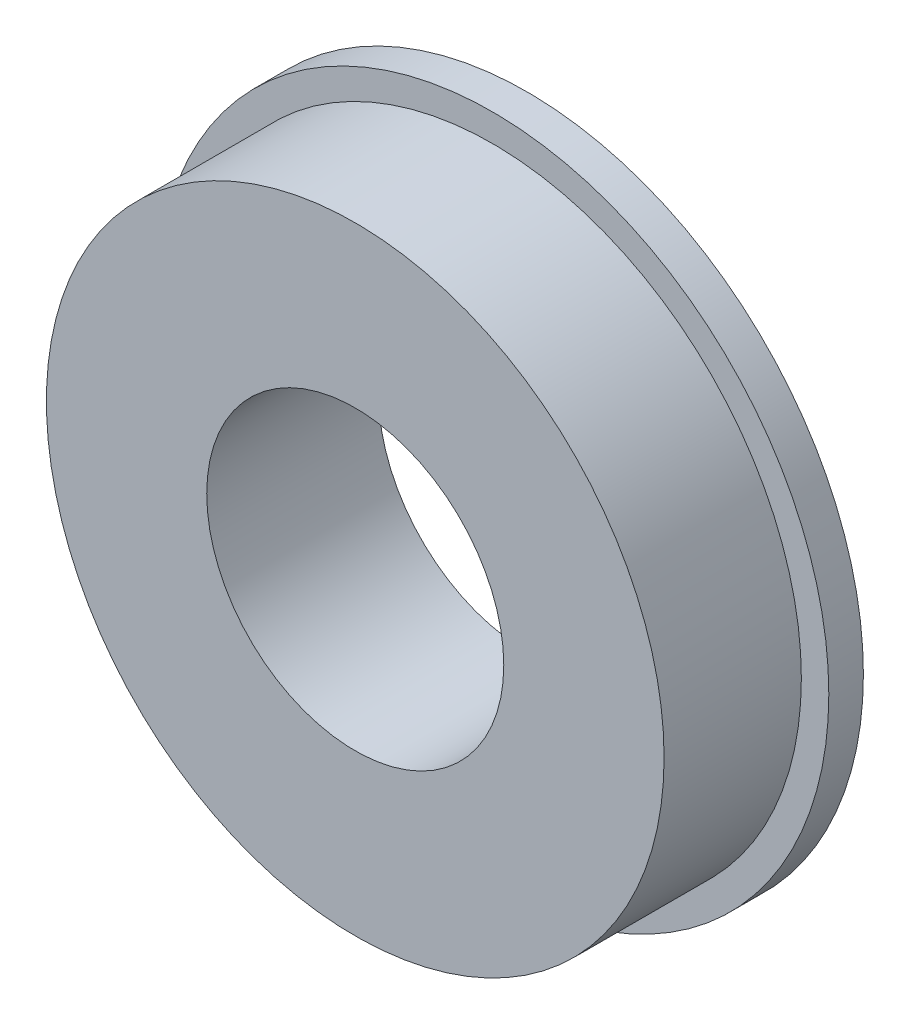
ISO-10303-21;
HEADER;
FILE_DESCRIPTION(('STEP AP214'),'2;1');
FILE_NAME('part.step','',(''),(''),'','','');
FILE_SCHEMA(('AUTOMOTIVE_DESIGN { 1 0 10303 214 1 1 1 1 }'));
ENDSEC;
DATA;
#1=APPLICATION_CONTEXT('core data for automotive mechanical design processes');
#2=APPLICATION_PROTOCOL_DEFINITION('international standard','automotive_design',2000,#1);
#3=PRODUCT_CONTEXT('',#1,'mechanical');
#4=PRODUCT('Part','Part','',(#3));
#5=PRODUCT_RELATED_PRODUCT_CATEGORY('part','',(#4));
#6=PRODUCT_DEFINITION_FORMATION('','',#4);
#7=PRODUCT_DEFINITION_CONTEXT('part definition',#1,'design');
#8=PRODUCT_DEFINITION('design','',#6,#7);
#9=PRODUCT_DEFINITION_SHAPE('','',#8);
#10=(LENGTH_UNIT() NAMED_UNIT(*) SI_UNIT(.MILLI.,.METRE.));
#11=(NAMED_UNIT(*) PLANE_ANGLE_UNIT() SI_UNIT($,.RADIAN.));
#12=(NAMED_UNIT(*) SI_UNIT($,.STERADIAN.) SOLID_ANGLE_UNIT());
#13=UNCERTAINTY_MEASURE_WITH_UNIT(LENGTH_MEASURE(1.E-05),#10,'distance_accuracy_value','');
#14=(GEOMETRIC_REPRESENTATION_CONTEXT(3) GLOBAL_UNCERTAINTY_ASSIGNED_CONTEXT((#13)) GLOBAL_UNIT_ASSIGNED_CONTEXT((#10,
#11,#12)) REPRESENTATION_CONTEXT('',''));
#15=CARTESIAN_POINT('',(0.,0.,0.));
#16=DIRECTION('',(0.,0.,1.));
#17=DIRECTION('',(1.,0.,0.));
#18=AXIS2_PLACEMENT_3D('',#15,#16,#17);
#19=CARTESIAN_POINT('',(15.5575000000001,0.,1003.12372616108));
#20=DIRECTION('',(0.,0.,1.));
#21=DIRECTION('',(1.,0.,0.));
#22=AXIS2_PLACEMENT_3D('',#19,#20,#21);
#23=CYLINDRICAL_SURFACE('',#22,15.5575000000001);
#24=CARTESIAN_POINT('',(15.5575000000001,0.,1.60019999999994));
#25=DIRECTION('',(0.,0.,1.));
#26=DIRECTION('',(1.,0.,0.));
#27=AXIS2_PLACEMENT_3D('',#24,#25,#26);
#28=CIRCLE('',#27,15.5575000000001);
#29=CARTESIAN_POINT('',(31.1150000000002,0.,1.60019999999994));
#30=VERTEX_POINT('',#29);
#31=EDGE_CURVE('E80',#30,#30,#28,.T.);
#32=ORIENTED_EDGE('',*,*,#31,.F.);
#33=EDGE_LOOP('',(#32));
#34=FACE_BOUND('',#33,.T.);
#35=CARTESIAN_POINT('',(15.5575000000001,0.,0.));
#36=DIRECTION('',(0.,0.,1.));
#37=DIRECTION('',(1.,0.,0.));
#38=AXIS2_PLACEMENT_3D('',#35,#36,#37);
#39=CIRCLE('',#38,15.5575000000001);
#40=CARTESIAN_POINT('',(31.1150000000002,0.,0.));
#41=VERTEX_POINT('',#40);
#42=EDGE_CURVE('E10',#41,#41,#39,.T.);
#43=ORIENTED_EDGE('',*,*,#42,.T.);
#44=EDGE_LOOP('',(#43));
#45=FACE_BOUND('',#44,.T.);
#46=ADVANCED_FACE('F37',(#34,#45),#23,.T.);
#47=CARTESIAN_POINT('',(0.,0.,0.));
#48=DIRECTION('',(0.,0.,1.));
#49=DIRECTION('',(1.,0.,0.));
#50=AXIS2_PLACEMENT_3D('',#47,#48,#49);
#51=PLANE('',#50);
#52=ORIENTED_EDGE('',*,*,#42,.F.);
#53=EDGE_LOOP('',(#52));
#54=FACE_BOUND('',#53,.T.);
#55=CARTESIAN_POINT('',(15.5575000000001,0.,0.));
#56=DIRECTION('',(0.,0.,1.));
#57=DIRECTION('',(1.,0.,0.));
#58=AXIS2_PLACEMENT_3D('',#55,#56,#57);
#59=CIRCLE('',#58,12.6619000000001);
#60=CARTESIAN_POINT('',(28.2194000000002,0.,0.));
#61=VERTEX_POINT('',#60);
#62=EDGE_CURVE('E44',#61,#61,#59,.T.);
#63=ORIENTED_EDGE('',*,*,#62,.T.);
#64=EDGE_LOOP('',(#63));
#65=FACE_BOUND('',#64,.T.);
#66=ADVANCED_FACE('F88',(#54,#65),#51,.F.);
#67=CARTESIAN_POINT('',(15.5575000000001,0.,1003.12372616108));
#68=DIRECTION('',(0.,0.,1.));
#69=DIRECTION('',(1.,0.,0.));
#70=AXIS2_PLACEMENT_3D('',#67,#68,#69);
#71=CYLINDRICAL_SURFACE('',#70,12.6619000000001);
#72=ORIENTED_EDGE('',*,*,#62,.F.);
#73=EDGE_LOOP('',(#72));
#74=FACE_BOUND('',#73,.T.);
#75=CARTESIAN_POINT('',(15.5575000000001,0.,0.634999999999941));
#76=DIRECTION('',(0.,0.,1.));
#77=DIRECTION('',(1.,0.,0.));
#78=AXIS2_PLACEMENT_3D('',#75,#76,#77);
#79=CIRCLE('',#78,12.6619000000001);
#80=CARTESIAN_POINT('',(28.2194000000002,0.,0.634999999999941));
#81=VERTEX_POINT('',#80);
#82=EDGE_CURVE('E49',#81,#81,#79,.T.);
#83=ORIENTED_EDGE('',*,*,#82,.T.);
#84=EDGE_LOOP('',(#83));
#85=FACE_BOUND('',#84,.T.);
#86=ADVANCED_FACE('F92',(#74,#85),#71,.F.);
#87=CARTESIAN_POINT('',(2.8956,0.,0.635));
#88=DIRECTION('',(0.,0.,1.));
#89=DIRECTION('',(1.,0.,0.));
#90=AXIS2_PLACEMENT_3D('',#87,#88,#89);
#91=PLANE('',#90);
#92=ORIENTED_EDGE('',*,*,#82,.F.);
#93=EDGE_LOOP('',(#92));
#94=FACE_BOUND('',#93,.T.);
#95=CARTESIAN_POINT('',(15.5575000000001,0.,0.634999999999941));
#96=DIRECTION('',(0.,0.,1.));
#97=DIRECTION('',(1.,0.,0.));
#98=AXIS2_PLACEMENT_3D('',#95,#96,#97);
#99=CIRCLE('',#98,9.76630000000012);
#100=CARTESIAN_POINT('',(25.3238000000002,0.,0.634999999999941));
#101=VERTEX_POINT('',#100);
#102=EDGE_CURVE('E54',#101,#101,#99,.T.);
#103=ORIENTED_EDGE('',*,*,#102,.T.);
#104=EDGE_LOOP('',(#103));
#105=FACE_BOUND('',#104,.T.);
#106=ADVANCED_FACE('F97',(#94,#105),#91,.F.);
#107=CARTESIAN_POINT('',(15.5575000000001,0.,1003.12372616108));
#108=DIRECTION('',(0.,0.,1.));
#109=DIRECTION('',(1.,0.,0.));
#110=AXIS2_PLACEMENT_3D('',#107,#108,#109);
#111=CYLINDRICAL_SURFACE('',#110,9.76630000000012);
#112=ORIENTED_EDGE('',*,*,#102,.F.);
#113=EDGE_LOOP('',(#112));
#114=FACE_BOUND('',#113,.T.);
#115=CARTESIAN_POINT('',(15.5575000000001,0.,0.));
#116=DIRECTION('',(0.,0.,1.));
#117=DIRECTION('',(1.,0.,0.));
#118=AXIS2_PLACEMENT_3D('',#115,#116,#117);
#119=CIRCLE('',#118,9.76630000000012);
#120=CARTESIAN_POINT('',(25.3238000000002,0.,0.));
#121=VERTEX_POINT('',#120);
#122=EDGE_CURVE('E60',#121,#121,#119,.T.);
#123=ORIENTED_EDGE('',*,*,#122,.T.);
#124=EDGE_LOOP('',(#123));
#125=FACE_BOUND('',#124,.T.);
#126=ADVANCED_FACE('F103',(#114,#125),#111,.T.);
#127=CARTESIAN_POINT('',(5.7912,0.,0.));
#128=DIRECTION('',(0.,0.,1.));
#129=DIRECTION('',(1.,0.,0.));
#130=AXIS2_PLACEMENT_3D('',#127,#128,#129);
#131=PLANE('',#130);
#132=ORIENTED_EDGE('',*,*,#122,.F.);
#133=EDGE_LOOP('',(#132));
#134=FACE_BOUND('',#133,.T.);
#135=CARTESIAN_POINT('',(15.5575000000001,0.,0.));
#136=DIRECTION('',(0.,0.,1.));
#137=DIRECTION('',(1.,0.,0.));
#138=AXIS2_PLACEMENT_3D('',#135,#136,#137);
#139=CIRCLE('',#138,6.87070000000012);
#140=CARTESIAN_POINT('',(22.4282000000002,0.,0.));
#141=VERTEX_POINT('',#140);
#142=EDGE_CURVE('E64',#141,#141,#139,.T.);
#143=ORIENTED_EDGE('',*,*,#142,.T.);
#144=EDGE_LOOP('',(#143));
#145=FACE_BOUND('',#144,.T.);
#146=ADVANCED_FACE('F107',(#134,#145),#131,.F.);
#147=CARTESIAN_POINT('',(15.5575000000001,0.,1003.12372616108));
#148=DIRECTION('',(0.,0.,1.));
#149=DIRECTION('',(1.,0.,0.));
#150=AXIS2_PLACEMENT_3D('',#147,#148,#149);
#151=CYLINDRICAL_SURFACE('',#150,6.87070000000012);
#152=ORIENTED_EDGE('',*,*,#142,.F.);
#153=EDGE_LOOP('',(#152));
#154=FACE_BOUND('',#153,.T.);
#155=CARTESIAN_POINT('',(15.5575000000001,0.,7.95020000000002));
#156=DIRECTION('',(0.,0.,1.));
#157=DIRECTION('',(1.,0.,0.));
#158=AXIS2_PLACEMENT_3D('',#155,#156,#157);
#159=CIRCLE('',#158,6.87070000000012);
#160=CARTESIAN_POINT('',(22.4282000000002,0.,7.95020000000002));
#161=VERTEX_POINT('',#160);
#162=EDGE_CURVE('E68',#161,#161,#159,.T.);
#163=ORIENTED_EDGE('',*,*,#162,.T.);
#164=EDGE_LOOP('',(#163));
#165=FACE_BOUND('',#164,.T.);
#166=ADVANCED_FACE('F111',(#154,#165),#151,.F.);
#167=CARTESIAN_POINT('',(8.6868,0.,7.9502));
#168=DIRECTION('',(0.,0.,-1.));
#169=DIRECTION('',(-1.,0.,0.));
#170=AXIS2_PLACEMENT_3D('',#167,#168,#169);
#171=PLANE('',#170);
#172=ORIENTED_EDGE('',*,*,#162,.F.);
#173=EDGE_LOOP('',(#172));
#174=FACE_BOUND('',#173,.T.);
#175=CARTESIAN_POINT('',(15.5575000000001,0.,7.95020000000002));
#176=DIRECTION('',(0.,0.,1.));
#177=DIRECTION('',(1.,0.,0.));
#178=AXIS2_PLACEMENT_3D('',#175,#176,#177);
#179=CIRCLE('',#178,14.2875000000001);
#180=CARTESIAN_POINT('',(29.8450000000002,0.,7.95020000000002));
#181=VERTEX_POINT('',#180);
#182=EDGE_CURVE('E72',#181,#181,#179,.T.);
#183=ORIENTED_EDGE('',*,*,#182,.T.);
#184=EDGE_LOOP('',(#183));
#185=FACE_BOUND('',#184,.T.);
#186=ADVANCED_FACE('F115',(#174,#185),#171,.F.);
#187=CARTESIAN_POINT('',(15.5575000000001,0.,1003.12372616108));
#188=DIRECTION('',(0.,0.,1.));
#189=DIRECTION('',(1.,0.,0.));
#190=AXIS2_PLACEMENT_3D('',#187,#188,#189);
#191=CYLINDRICAL_SURFACE('',#190,14.2875000000001);
#192=ORIENTED_EDGE('',*,*,#182,.F.);
#193=EDGE_LOOP('',(#192));
#194=FACE_BOUND('',#193,.T.);
#195=CARTESIAN_POINT('',(15.5575000000001,0.,1.60019999999994));
#196=DIRECTION('',(0.,0.,1.));
#197=DIRECTION('',(1.,0.,0.));
#198=AXIS2_PLACEMENT_3D('',#195,#196,#197);
#199=CIRCLE('',#198,14.2875000000001);
#200=CARTESIAN_POINT('',(29.8450000000002,0.,1.60019999999994));
#201=VERTEX_POINT('',#200);
#202=EDGE_CURVE('E76',#201,#201,#199,.T.);
#203=ORIENTED_EDGE('',*,*,#202,.T.);
#204=EDGE_LOOP('',(#203));
#205=FACE_BOUND('',#204,.T.);
#206=ADVANCED_FACE('F119',(#194,#205),#191,.T.);
#207=CARTESIAN_POINT('',(1.27,0.,1.6002));
#208=DIRECTION('',(0.,0.,-1.));
#209=DIRECTION('',(-1.,0.,0.));
#210=AXIS2_PLACEMENT_3D('',#207,#208,#209);
#211=PLANE('',#210);
#212=ORIENTED_EDGE('',*,*,#202,.F.);
#213=EDGE_LOOP('',(#212));
#214=FACE_BOUND('',#213,.T.);
#215=ORIENTED_EDGE('',*,*,#31,.T.);
#216=EDGE_LOOP('',(#215));
#217=FACE_BOUND('',#216,.T.);
#218=ADVANCED_FACE('F85',(#214,#217),#211,.F.);
#219=CLOSED_SHELL('',(#46,#66,#86,#106,#126,#146,#166,#186,#206,#218));
#220=MANIFOLD_SOLID_BREP('B2',#219);
#221=ADVANCED_BREP_SHAPE_REPRESENTATION('',(#18,#220),#14);
#222=SHAPE_DEFINITION_REPRESENTATION(#9,#221);
ENDSEC;
END-ISO-10303-21;
